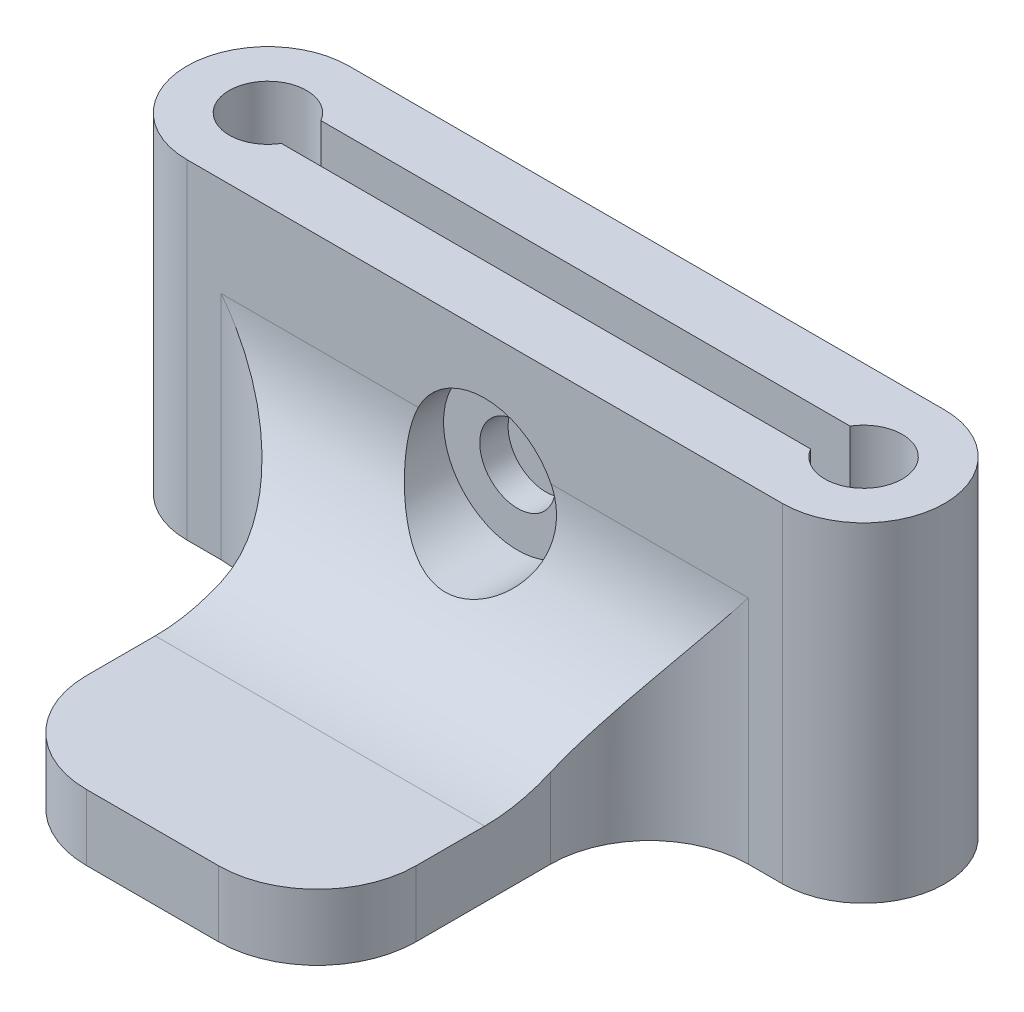
ISO-10303-21;
HEADER;
FILE_DESCRIPTION(('STEP AP214'),'2;1');
FILE_NAME('part.step','',(''),(''),'','','');
FILE_SCHEMA(('AUTOMOTIVE_DESIGN { 1 0 10303 214 1 1 1 1 }'));
ENDSEC;
DATA;
#1=APPLICATION_CONTEXT('core data for automotive mechanical design processes');
#2=APPLICATION_PROTOCOL_DEFINITION('international standard','automotive_design',2000,#1);
#3=PRODUCT_CONTEXT('',#1,'mechanical');
#4=PRODUCT('Part','Part','',(#3));
#5=PRODUCT_RELATED_PRODUCT_CATEGORY('part','',(#4));
#6=PRODUCT_DEFINITION_FORMATION('','',#4);
#7=PRODUCT_DEFINITION_CONTEXT('part definition',#1,'design');
#8=PRODUCT_DEFINITION('design','',#6,#7);
#9=PRODUCT_DEFINITION_SHAPE('','',#8);
#10=(LENGTH_UNIT() NAMED_UNIT(*) SI_UNIT(.MILLI.,.METRE.));
#11=(NAMED_UNIT(*) PLANE_ANGLE_UNIT() SI_UNIT($,.RADIAN.));
#12=(NAMED_UNIT(*) SI_UNIT($,.STERADIAN.) SOLID_ANGLE_UNIT());
#13=UNCERTAINTY_MEASURE_WITH_UNIT(LENGTH_MEASURE(1.E-05),#10,'distance_accuracy_value','');
#14=(GEOMETRIC_REPRESENTATION_CONTEXT(3) GLOBAL_UNCERTAINTY_ASSIGNED_CONTEXT((#13)) GLOBAL_UNIT_ASSIGNED_CONTEXT((#10,
#11,#12)) REPRESENTATION_CONTEXT('',''));
#15=CARTESIAN_POINT('',(0.,0.,0.));
#16=DIRECTION('',(0.,0.,1.));
#17=DIRECTION('',(1.,0.,0.));
#18=AXIS2_PLACEMENT_3D('',#15,#16,#17);
#19=CARTESIAN_POINT('',(0.,6.,-2.46));
#20=DIRECTION('',(0.,0.,1.));
#21=DIRECTION('',(1.,0.,0.));
#22=AXIS2_PLACEMENT_3D('',#19,#20,#21);
#23=CYLINDRICAL_SURFACE('',#22,1.15);
#24=CARTESIAN_POINT('',(0.,6.,-0.6));
#25=DIRECTION('',(0.,0.,-1.));
#26=DIRECTION('',(-1.,0.,0.));
#27=AXIS2_PLACEMENT_3D('',#24,#25,#26);
#28=CIRCLE('',#27,1.15);
#29=CARTESIAN_POINT('',(-1.15,6.,-0.6));
#30=VERTEX_POINT('',#29);
#31=EDGE_CURVE('E256',#30,#30,#28,.T.);
#32=ORIENTED_EDGE('',*,*,#31,.F.);
#33=EDGE_LOOP('',(#32));
#34=FACE_BOUND('',#33,.T.);
#35=CARTESIAN_POINT('',(0.,6.,-1.46));
#36=DIRECTION('',(0.,0.,-1.));
#37=DIRECTION('',(-1.,0.,0.));
#38=AXIS2_PLACEMENT_3D('',#35,#36,#37);
#39=CIRCLE('',#38,1.15);
#40=CARTESIAN_POINT('',(-1.15,6.,-1.46));
#41=VERTEX_POINT('',#40);
#42=EDGE_CURVE('E40',#41,#41,#39,.F.);
#43=ORIENTED_EDGE('',*,*,#42,.F.);
#44=EDGE_LOOP('',(#43));
#45=FACE_BOUND('',#44,.T.);
#46=ADVANCED_FACE('F35',(#34,#45),#23,.F.);
#47=CARTESIAN_POINT('',(0.,7.,7.46));
#48=DIRECTION('',(1.,0.,0.));
#49=DIRECTION('',(0.,0.,-1.));
#50=AXIS2_PLACEMENT_3D('',#47,#48,#49);
#51=CYLINDRICAL_SURFACE('',#50,5.);
#52=CARTESIAN_POINT('',(-2.01556443707464,7.,2.46));
#53=CARTESIAN_POINT('',(-2.04175036487948,6.94723877501467,2.45999300896593));
#54=CARTESIAN_POINT('',(-2.06585073480588,6.89344078288716,2.46083496798393));
#55=CARTESIAN_POINT('',(-2.109745996837,6.78417417126407,2.46436298875684));
#56=CARTESIAN_POINT('',(-2.1295408156261,6.72870552333859,2.46704908191073));
#57=CARTESIAN_POINT('',(-2.16464542210361,6.61664371589301,2.47440230646445));
#58=CARTESIAN_POINT('',(-2.17996638703904,6.56005374260594,2.47906442828374));
#59=CARTESIAN_POINT('',(-2.20611600501055,6.4460681434285,2.49044783021604));
#60=CARTESIAN_POINT('',(-2.21694490592385,6.38867256217325,2.49716899667303));
#61=CARTESIAN_POINT('',(-2.24264423931978,6.21582810991499,2.52051329062134));
#62=CARTESIAN_POINT('',(-2.25073044685787,6.09971140376437,2.54031784448049));
#63=CARTESIAN_POINT('',(-2.24916345106013,5.86938691802106,2.58808175614079));
#64=CARTESIAN_POINT('',(-2.23950854097209,5.75517932315762,2.61604189831789));
#65=CARTESIAN_POINT('',(-2.20330128362021,5.52966744780162,2.67961675487502));
#66=CARTESIAN_POINT('',(-2.17647802356564,5.41844005746845,2.71534801669427));
#67=CARTESIAN_POINT('',(-2.10720173346062,5.20312323497078,2.7926295949892));
#68=CARTESIAN_POINT('',(-2.0647414242777,5.09903715393737,2.83418261593549));
#69=CARTESIAN_POINT('',(-1.96042439546428,4.88895331481458,2.92590946768372));
#70=CARTESIAN_POINT('',(-1.89697947371727,4.78394054653244,2.97653001272573));
#71=CARTESIAN_POINT('',(-1.75450332402742,4.58610252889114,3.07986468572548));
#72=CARTESIAN_POINT('',(-1.67545398528858,4.49329165181003,3.1325811889762));
#73=CARTESIAN_POINT('',(-1.49316365537025,4.31138982243017,3.2429004495677));
#74=CARTESIAN_POINT('',(-1.38818807487377,4.22394569484173,3.30037037042072));
#75=CARTESIAN_POINT('',(-1.16178647687953,4.06827465645595,3.40858514713366));
#76=CARTESIAN_POINT('',(-1.04038385361374,4.00002083408997,3.45933936732241));
#77=CARTESIAN_POINT('',(-0.818732140894735,3.90178255115438,3.53523449939828));
#78=CARTESIAN_POINT('',(-0.721958836539561,3.86643433798268,3.56357487065409));
#79=CARTESIAN_POINT('',(-0.522318848532056,3.80901098755309,3.61045791169847));
#80=CARTESIAN_POINT('',(-0.419461274598913,3.78691653228039,3.62901483654402));
#81=CARTESIAN_POINT('',(-0.209464273058739,3.75724988232855,3.65408703508113));
#82=CARTESIAN_POINT('',(-0.102301160703161,3.74977401624838,3.66052242427202));
#83=CARTESIAN_POINT('',(0.111969247602375,3.75023636948332,3.6601266156609));
#84=CARTESIAN_POINT('',(0.219076546107482,3.75817380707721,3.65329609067029));
#85=CARTESIAN_POINT('',(0.419590330432457,3.78736773012919,3.62864295591844));
#86=CARTESIAN_POINT('',(0.513336099698098,3.80729707031603,3.61191811710916));
#87=CARTESIAN_POINT('',(0.695858269669967,3.85820768835038,3.57024174275521));
#88=CARTESIAN_POINT('',(0.78463079545407,3.88919744912833,3.54528389391442));
#89=CARTESIAN_POINT('',(0.988138973411805,3.97455999036677,3.47871671282776));
#90=CARTESIAN_POINT('',(1.10013056457163,4.03334345609058,3.43437259876656));
#91=CARTESIAN_POINT('',(1.31091732161737,4.16707127503923,3.3391673889957));
#92=CARTESIAN_POINT('',(1.40969339748486,4.24203860643536,3.2882970693531));
#93=CARTESIAN_POINT('',(1.59427449664379,4.40741229380983,3.18352999409671));
#94=CARTESIAN_POINT('',(1.6798884743269,4.49801163912922,3.12960187211222));
#95=CARTESIAN_POINT('',(1.83532446629782,4.69249054414813,3.02291669066662));
#96=CARTESIAN_POINT('',(1.90514521906432,4.79637116368432,2.97015972505774));
#97=CARTESIAN_POINT('',(2.03341840310747,5.026963492781,2.86382861484484));
#98=CARTESIAN_POINT('',(2.09003243538265,5.1549197757315,2.81070161330166));
#99=CARTESIAN_POINT('',(2.17907744769574,5.42216037360604,2.71336204092652));
#100=CARTESIAN_POINT('',(2.21153056570779,5.56143418845957,2.6691413366759));
#101=CARTESIAN_POINT('',(2.24752413279597,5.83273526087939,2.59633360891));
#102=CARTESIAN_POINT('',(2.25359688946893,5.96412568215009,2.56663593014865));
#103=CARTESIAN_POINT('',(2.24230342081865,6.22791725385726,2.51815734328309));
#104=CARTESIAN_POINT('',(2.22495825661386,6.36031738975738,2.49936664760894));
#105=CARTESIAN_POINT('',(2.17625214454224,6.57840887217922,2.477018696461));
#106=CARTESIAN_POINT('',(2.15128327737051,6.66528823235687,2.47049475971174));
#107=CARTESIAN_POINT('',(2.09104857705997,6.83558498201691,2.46196938924199));
#108=CARTESIAN_POINT('',(2.05578791278093,6.91900408538639,2.45996568971696));
#109=CARTESIAN_POINT('',(2.01556443707464,7.,2.46));
#110=B_SPLINE_CURVE_WITH_KNOTS('',3,(#52,#53,#54,#55,#56,#57,#58,#59,#60,#61,#62,#63,#64,#65,
#66,#67,#68,#69,#70,#71,#72,#73,#74,#75,#76,#77,#78,#79,#80,#81,#82,#83,#84,#85,#86,#87,#88,#89,
#90,#91,#92,#93,#94,#95,#96,#97,#98,#99,#100,#101,#102,#103,#104,#105,#106,#107,#108,#109),
.UNSPECIFIED.,.F.,.F.,(4,2,2,2,2,2,2,2,2,2,2,2,2,2,2,2,2,2,2,2,2,2,2,2,2,2,2,2,4),(0.,
0.176656014845354,0.353315037582458,0.529528852443758,0.705732942331843,1.05810966727465,
1.41052029375898,1.7686337707166,2.12691416262203,2.52349284280533,2.92053453534118,
3.36310295556381,3.80504760765345,4.1243800628563,4.44324593691299,4.7642059770903,
5.08514973946491,5.37581603946379,5.66670575044184,6.06665472641688,6.46717533704566,
6.8730500290664,7.27895712985139,7.7255087481676,8.17165069836637,8.57386197025033,
8.97571175065633,9.24688301158131,9.51791831554301),.UNSPECIFIED.);
#111=CARTESIAN_POINT('',(-2.01556443707464,7.,2.46));
#112=VERTEX_POINT('',#111);
#113=CARTESIAN_POINT('',(2.01556443707464,7.,2.46));
#114=VERTEX_POINT('',#113);
#115=EDGE_CURVE('E11',#112,#114,#110,.T.);
#116=ORIENTED_EDGE('',*,*,#115,.F.);
#117=DIRECTION('',(-1.,0.,0.));
#118=VECTOR('',#117,1.);
#119=CARTESIAN_POINT('',(8.,7.,2.46));
#120=LINE('',#119,#118);
#121=CARTESIAN_POINT('',(-8.,7.,2.46));
#122=VERTEX_POINT('',#121);
#123=EDGE_CURVE('E381',#122,#112,#120,.F.);
#124=ORIENTED_EDGE('',*,*,#123,.F.);
#125=CARTESIAN_POINT('',(-5.,2.41742430504416,5.46));
#126=CARTESIAN_POINT('',(-4.99999007584464,2.45619433572678,5.37111111999838));
#127=CARTESIAN_POINT('',(-5.00394885534584,2.49756553159916,5.28342396283325));
#128=CARTESIAN_POINT('',(-5.01909527387803,2.58497092461001,5.11122034191126));
#129=CARTESIAN_POINT('',(-5.0302710810227,2.63099738574335,5.02669892763461));
#130=CARTESIAN_POINT('',(-5.05900041117813,2.72681315065254,4.86214197951033));
#131=CARTESIAN_POINT('',(-5.07648778239047,2.77655933013036,4.78206950990215));
#132=CARTESIAN_POINT('',(-5.11717439439445,2.87977402986982,4.62583225064516));
#133=CARTESIAN_POINT('',(-5.14037657272063,2.93324445430396,4.54966949508105));
#134=CARTESIAN_POINT('',(-5.19855781113315,3.05784842466416,4.38217655542122));
#135=CARTESIAN_POINT('',(-5.23503000053933,3.12994713640746,4.29208183123255));
#136=CARTESIAN_POINT('',(-5.3148218834273,3.27855552023904,4.11875784631887));
#137=CARTESIAN_POINT('',(-5.35814656010761,3.35506837641435,4.03553364946838));
#138=CARTESIAN_POINT('',(-5.45077079658604,3.51210422984339,3.87570229294977));
#139=CARTESIAN_POINT('',(-5.50009596147952,3.59264348248161,3.79912606240481));
#140=CARTESIAN_POINT('',(-5.60362354169447,3.75677463200056,3.65295852675565));
#141=CARTESIAN_POINT('',(-5.65782452771141,3.84036563004705,3.58336518725023));
#142=CARTESIAN_POINT('',(-5.79274014298285,4.04392463557509,3.42462300080977));
#143=CARTESIAN_POINT('',(-5.87542029554436,4.16512727065971,3.33871762693228));
#144=CARTESIAN_POINT('',(-6.04705542389688,4.41143609639691,3.17971495392395));
#145=CARTESIAN_POINT('',(-6.13601288528329,4.53654382227045,3.10662276873676));
#146=CARTESIAN_POINT('',(-6.31881575359726,4.78979065819426,2.97274090730703));
#147=CARTESIAN_POINT('',(-6.41266284424726,4.91793080404366,2.91195550452723));
#148=CARTESIAN_POINT('',(-6.6040431359243,5.17643888357417,2.80228261146679));
#149=CARTESIAN_POINT('',(-6.70157575105506,5.30680646136508,2.75339323916331));
#150=CARTESIAN_POINT('',(-6.99243555246832,5.69263762108821,2.62650236970021));
#151=CARTESIAN_POINT('',(-7.18963215160217,5.9505018544787,2.56433245016192));
#152=CARTESIAN_POINT('',(-7.58839523182633,6.46860044004562,2.48142008987375));
#153=CARTESIAN_POINT('',(-7.7899519738823,6.72882888152428,2.46059336538387));
#154=CARTESIAN_POINT('',(-7.99422653603207,6.99254648939585,2.46000417362007));
#155=CARTESIAN_POINT('',(-7.99711328912772,6.99627327159147,2.46000000728194));
#156=CARTESIAN_POINT('',(-8.,7.,2.46));
#157=B_SPLINE_CURVE_WITH_KNOTS('',3,(#125,#126,#127,#128,#129,#130,#131,#132,#133,#134,#135,
#136,#137,#138,#139,#140,#141,#142,#143,#144,#145,#146,#147,#148,#149,#150,#151,#152,#153,#154,
#155,#156),.UNSPECIFIED.,.F.,.F.,(4,2,2,2,2,2,2,2,2,2,2,2,2,2,2,4),(0.,0.29071592607896,
0.580956446582333,0.868239309782246,1.15567015190112,1.5181890748171,1.88097284765794,
2.24536288350868,2.60964644752272,3.11894232553606,3.62844101097637,4.13811631474608,
4.64771093234505,5.63631090330857,6.6228934001838,6.63703554133181),.UNSPECIFIED.);
#158=CARTESIAN_POINT('',(-5.,2.41742430504416,5.46));
#159=VERTEX_POINT('',#158);
#160=EDGE_CURVE('E387',#159,#122,#157,.T.);
#161=ORIENTED_EDGE('',*,*,#160,.F.);
#162=CARTESIAN_POINT('',(-5.,7.,7.46));
#163=DIRECTION('',(-1.,0.,0.));
#164=DIRECTION('',(0.,0.,1.));
#165=AXIS2_PLACEMENT_3D('',#162,#163,#164);
#166=CIRCLE('',#165,5.);
#167=CARTESIAN_POINT('',(-5.,2.,7.46));
#168=VERTEX_POINT('',#167);
#169=EDGE_CURVE('E384',#168,#159,#166,.F.);
#170=ORIENTED_EDGE('',*,*,#169,.F.);
#171=DIRECTION('',(-1.,0.,0.));
#172=VECTOR('',#171,1.);
#173=CARTESIAN_POINT('',(-8.,2.,7.46));
#174=LINE('',#173,#172);
#175=CARTESIAN_POINT('',(5.,2.,7.46));
#176=VERTEX_POINT('',#175);
#177=EDGE_CURVE('E377',#176,#168,#174,.T.);
#178=ORIENTED_EDGE('',*,*,#177,.F.);
#179=CARTESIAN_POINT('',(5.,7.,7.46));
#180=DIRECTION('',(1.,0.,0.));
#181=DIRECTION('',(0.,0.,-1.));
#182=AXIS2_PLACEMENT_3D('',#179,#180,#181);
#183=CIRCLE('',#182,5.);
#184=CARTESIAN_POINT('',(5.,2.41742430504416,5.46));
#185=VERTEX_POINT('',#184);
#186=EDGE_CURVE('E45',#185,#176,#183,.F.);
#187=ORIENTED_EDGE('',*,*,#186,.F.);
#188=CARTESIAN_POINT('',(5.,2.41742430504416,5.46));
#189=CARTESIAN_POINT('',(4.99999007584464,2.45619433572678,5.37111111999838));
#190=CARTESIAN_POINT('',(5.00394885534584,2.49756553159916,5.28342396283325));
#191=CARTESIAN_POINT('',(5.01909527387803,2.58497092461001,5.11122034191126));
#192=CARTESIAN_POINT('',(5.0302710810227,2.63099738574335,5.02669892763461));
#193=CARTESIAN_POINT('',(5.05900041117812,2.72681315065254,4.86214197951033));
#194=CARTESIAN_POINT('',(5.07648778239047,2.77655933013036,4.78206950990215));
#195=CARTESIAN_POINT('',(5.11717439439445,2.87977402986982,4.62583225064516));
#196=CARTESIAN_POINT('',(5.14037657272063,2.93324445430396,4.54966949508105));
#197=CARTESIAN_POINT('',(5.19855781113315,3.05784842466416,4.38217655542122));
#198=CARTESIAN_POINT('',(5.23503000053933,3.12994713640746,4.29208183123255));
#199=CARTESIAN_POINT('',(5.31482188342729,3.27855552023904,4.11875784631887));
#200=CARTESIAN_POINT('',(5.3581465601076,3.35506837641435,4.03553364946838));
#201=CARTESIAN_POINT('',(5.45077079658604,3.51210422984339,3.87570229294977));
#202=CARTESIAN_POINT('',(5.50009596147952,3.59264348248161,3.79912606240481));
#203=CARTESIAN_POINT('',(5.60362354169447,3.75677463200056,3.65295852675565));
#204=CARTESIAN_POINT('',(5.65782452771141,3.84036563004705,3.58336518725023));
#205=CARTESIAN_POINT('',(5.79274014298285,4.04392463557509,3.42462300080977));
#206=CARTESIAN_POINT('',(5.87542029554436,4.16512727065971,3.33871762693228));
#207=CARTESIAN_POINT('',(6.04705542389688,4.41143609639691,3.17971495392395));
#208=CARTESIAN_POINT('',(6.13601288528328,4.53654382227045,3.10662276873676));
#209=CARTESIAN_POINT('',(6.31881575359726,4.78979065819426,2.97274090730703));
#210=CARTESIAN_POINT('',(6.41266284424725,4.91793080404366,2.91195550452723));
#211=CARTESIAN_POINT('',(6.6040431359243,5.17643888357417,2.80228261146679));
#212=CARTESIAN_POINT('',(6.70157575105506,5.30680646136508,2.75339323916331));
#213=CARTESIAN_POINT('',(6.99243555246831,5.69263762108821,2.62650236970021));
#214=CARTESIAN_POINT('',(7.18963215160217,5.9505018544787,2.56433245016192));
#215=CARTESIAN_POINT('',(7.58839523182633,6.46860044004562,2.48142008987375));
#216=CARTESIAN_POINT('',(7.7899519738823,6.72882888152428,2.46059336538387));
#217=CARTESIAN_POINT('',(7.99422653603207,6.99254648939585,2.46000417362007));
#218=CARTESIAN_POINT('',(7.99711328912772,6.99627327159147,2.46000000728194));
#219=CARTESIAN_POINT('',(8.,7.,2.46));
#220=B_SPLINE_CURVE_WITH_KNOTS('',3,(#188,#189,#190,#191,#192,#193,#194,#195,#196,#197,#198,
#199,#200,#201,#202,#203,#204,#205,#206,#207,#208,#209,#210,#211,#212,#213,#214,#215,#216,#217,
#218,#219),.UNSPECIFIED.,.F.,.F.,(4,2,2,2,2,2,2,2,2,2,2,2,2,2,2,4),(0.,0.29071592607896,
0.580956446582333,0.868239309782246,1.15567015190112,1.5181890748171,1.88097284765794,
2.24536288350868,2.60964644752272,3.11894232553606,3.62844101097637,4.13811631474608,
4.64771093234505,5.63631090330857,6.6228934001838,6.63703554133181),.UNSPECIFIED.);
#221=CARTESIAN_POINT('',(8.,7.,2.46));
#222=VERTEX_POINT('',#221);
#223=EDGE_CURVE('E394',#222,#185,#220,.F.);
#224=ORIENTED_EDGE('',*,*,#223,.F.);
#225=EDGE_CURVE('E380',#114,#222,#120,.F.);
#226=ORIENTED_EDGE('',*,*,#225,.F.);
#227=EDGE_LOOP('',(#116,#124,#161,#170,#178,#187,#224,#226));
#228=FACE_BOUND('',#227,.T.);
#229=ADVANCED_FACE('F37',(#228),#51,.F.);
#230=CARTESIAN_POINT('',(-9.04,10.,0.));
#231=DIRECTION('',(0.,1.,0.));
#232=DIRECTION('',(0.,0.,1.));
#233=AXIS2_PLACEMENT_3D('',#230,#231,#232);
#234=PLANE('',#233);
#235=DIRECTION('',(1.,0.,0.));
#236=VECTOR('',#235,1.);
#237=CARTESIAN_POINT('',(-8.02974013244116,10.,-0.6));
#238=LINE('',#237,#236);
#239=CARTESIAN_POINT('',(-8.02974013244116,10.,-0.599999999999993));
#240=VERTEX_POINT('',#239);
#241=CARTESIAN_POINT('',(8.02974013244116,10.,-0.6));
#242=VERTEX_POINT('',#241);
#243=EDGE_CURVE('E268',#240,#242,#238,.T.);
#244=ORIENTED_EDGE('',*,*,#243,.T.);
#245=CARTESIAN_POINT('',(9.04,10.,0.));
#246=DIRECTION('',(0.,1.,0.));
#247=DIRECTION('',(0.,0.,1.));
#248=AXIS2_PLACEMENT_3D('',#245,#246,#247);
#249=CIRCLE('',#248,1.175);
#250=CARTESIAN_POINT('',(8.02974013244116,10.,0.6));
#251=VERTEX_POINT('',#250);
#252=EDGE_CURVE('E308',#251,#242,#249,.T.);
#253=ORIENTED_EDGE('',*,*,#252,.F.);
#254=DIRECTION('',(-1.,0.,0.));
#255=VECTOR('',#254,1.);
#256=CARTESIAN_POINT('',(-8.02974013244116,10.,0.6));
#257=LINE('',#256,#255);
#258=CARTESIAN_POINT('',(-8.02974013244116,10.,0.6));
#259=VERTEX_POINT('',#258);
#260=EDGE_CURVE('E265',#251,#259,#257,.T.);
#261=ORIENTED_EDGE('',*,*,#260,.T.);
#262=CARTESIAN_POINT('',(-9.04,10.,0.));
#263=DIRECTION('',(0.,1.,0.));
#264=DIRECTION('',(0.,0.,-1.));
#265=AXIS2_PLACEMENT_3D('',#262,#263,#264);
#266=CIRCLE('',#265,1.175);
#267=EDGE_CURVE('E302',#240,#259,#266,.T.);
#268=ORIENTED_EDGE('',*,*,#267,.F.);
#269=EDGE_LOOP('',(#244,#253,#261,#268));
#270=FACE_BOUND('',#269,.T.);
#271=CARTESIAN_POINT('',(-9.04,10.,0.));
#272=DIRECTION('',(0.,1.,0.));
#273=DIRECTION('',(0.,0.,1.));
#274=AXIS2_PLACEMENT_3D('',#271,#272,#273);
#275=CIRCLE('',#274,2.46);
#276=CARTESIAN_POINT('',(-9.04,10.,-2.46));
#277=VERTEX_POINT('',#276);
#278=CARTESIAN_POINT('',(-9.04,10.,2.46));
#279=VERTEX_POINT('',#278);
#280=EDGE_CURVE('E314',#277,#279,#275,.T.);
#281=ORIENTED_EDGE('',*,*,#280,.T.);
#282=DIRECTION('',(1.,0.,0.));
#283=VECTOR('',#282,1.);
#284=CARTESIAN_POINT('',(-9.04,10.,2.46));
#285=LINE('',#284,#283);
#286=CARTESIAN_POINT('',(9.04,10.,2.46));
#287=VERTEX_POINT('',#286);
#288=EDGE_CURVE('E317',#279,#287,#285,.T.);
#289=ORIENTED_EDGE('',*,*,#288,.T.);
#290=CARTESIAN_POINT('',(9.04,10.,0.));
#291=DIRECTION('',(0.,1.,0.));
#292=DIRECTION('',(0.,0.,1.));
#293=AXIS2_PLACEMENT_3D('',#290,#291,#292);
#294=CIRCLE('',#293,2.46);
#295=CARTESIAN_POINT('',(9.04,10.,-2.46));
#296=VERTEX_POINT('',#295);
#297=EDGE_CURVE('E320',#287,#296,#294,.T.);
#298=ORIENTED_EDGE('',*,*,#297,.T.);
#299=DIRECTION('',(-1.,0.,0.));
#300=VECTOR('',#299,1.);
#301=CARTESIAN_POINT('',(-9.04,10.,-2.46));
#302=LINE('',#301,#300);
#303=EDGE_CURVE('E322',#296,#277,#302,.T.);
#304=ORIENTED_EDGE('',*,*,#303,.T.);
#305=EDGE_LOOP('',(#281,#289,#298,#304));
#306=FACE_BOUND('',#305,.T.);
#307=ADVANCED_FACE('F440',(#270,#306),#234,.T.);
#308=CARTESIAN_POINT('',(-9.04,0.,0.));
#309=DIRECTION('',(0.,1.,0.));
#310=DIRECTION('',(0.,0.,1.));
#311=AXIS2_PLACEMENT_3D('',#308,#309,#310);
#312=PLANE('',#311);
#313=DIRECTION('',(-1.,0.,0.));
#314=VECTOR('',#313,1.);
#315=CARTESIAN_POINT('',(-5.,0.,12.54));
#316=LINE('',#315,#314);
#317=CARTESIAN_POINT('',(2.,0.,12.54));
#318=VERTEX_POINT('',#317);
#319=CARTESIAN_POINT('',(-2.,0.,12.54));
#320=VERTEX_POINT('',#319);
#321=EDGE_CURVE('E297',#318,#320,#316,.T.);
#322=ORIENTED_EDGE('',*,*,#321,.T.);
#323=CARTESIAN_POINT('',(-2.,0.,9.54));
#324=DIRECTION('',(0.,1.,0.));
#325=DIRECTION('',(0.,0.,1.));
#326=AXIS2_PLACEMENT_3D('',#323,#324,#325);
#327=CIRCLE('',#326,3.);
#328=CARTESIAN_POINT('',(-5.,0.,9.54));
#329=VERTEX_POINT('',#328);
#330=EDGE_CURVE('E352',#320,#329,#327,.F.);
#331=ORIENTED_EDGE('',*,*,#330,.T.);
#332=DIRECTION('',(0.,0.,-1.));
#333=VECTOR('',#332,1.);
#334=CARTESIAN_POINT('',(-5.,0.,12.54));
#335=LINE('',#334,#333);
#336=CARTESIAN_POINT('',(-5.,0.,5.46));
#337=VERTEX_POINT('',#336);
#338=EDGE_CURVE('E288',#329,#337,#335,.T.);
#339=ORIENTED_EDGE('',*,*,#338,.T.);
#340=CARTESIAN_POINT('',(-8.,0.,5.46));
#341=DIRECTION('',(0.,1.,0.));
#342=DIRECTION('',(0.,0.,1.));
#343=AXIS2_PLACEMENT_3D('',#340,#341,#342);
#344=CIRCLE('',#343,3.);
#345=CARTESIAN_POINT('',(-8.,0.,2.46));
#346=VERTEX_POINT('',#345);
#347=EDGE_CURVE('E375',#337,#346,#344,.T.);
#348=ORIENTED_EDGE('',*,*,#347,.T.);
#349=DIRECTION('',(1.,0.,0.));
#350=VECTOR('',#349,1.);
#351=CARTESIAN_POINT('',(-9.04,0.,2.46));
#352=LINE('',#351,#350);
#353=CARTESIAN_POINT('',(-9.04,0.,2.46));
#354=VERTEX_POINT('',#353);
#355=EDGE_CURVE('E328',#354,#346,#352,.T.);
#356=ORIENTED_EDGE('',*,*,#355,.F.);
#357=CARTESIAN_POINT('',(-9.04,0.,0.));
#358=DIRECTION('',(0.,1.,0.));
#359=DIRECTION('',(0.,0.,1.));
#360=AXIS2_PLACEMENT_3D('',#357,#358,#359);
#361=CIRCLE('',#360,2.46);
#362=CARTESIAN_POINT('',(-9.04,0.,-2.46));
#363=VERTEX_POINT('',#362);
#364=EDGE_CURVE('E311',#363,#354,#361,.T.);
#365=ORIENTED_EDGE('',*,*,#364,.F.);
#366=DIRECTION('',(-1.,0.,0.));
#367=VECTOR('',#366,1.);
#368=CARTESIAN_POINT('',(-9.04,0.,-2.46));
#369=LINE('',#368,#367);
#370=CARTESIAN_POINT('',(9.04,0.,-2.46));
#371=VERTEX_POINT('',#370);
#372=EDGE_CURVE('E318',#371,#363,#369,.T.);
#373=ORIENTED_EDGE('',*,*,#372,.F.);
#374=CARTESIAN_POINT('',(9.04,0.,0.));
#375=DIRECTION('',(0.,1.,0.));
#376=DIRECTION('',(0.,0.,1.));
#377=AXIS2_PLACEMENT_3D('',#374,#375,#376);
#378=CIRCLE('',#377,2.46);
#379=CARTESIAN_POINT('',(9.04,0.,2.46));
#380=VERTEX_POINT('',#379);
#381=EDGE_CURVE('E331',#380,#371,#378,.T.);
#382=ORIENTED_EDGE('',*,*,#381,.F.);
#383=CARTESIAN_POINT('',(8.,0.,2.46));
#384=VERTEX_POINT('',#383);
#385=EDGE_CURVE('E327',#384,#380,#352,.T.);
#386=ORIENTED_EDGE('',*,*,#385,.F.);
#387=CARTESIAN_POINT('',(8.,0.,5.46));
#388=DIRECTION('',(0.,1.,0.));
#389=DIRECTION('',(0.,0.,1.));
#390=AXIS2_PLACEMENT_3D('',#387,#388,#389);
#391=CIRCLE('',#390,3.);
#392=CARTESIAN_POINT('',(5.,0.,5.46));
#393=VERTEX_POINT('',#392);
#394=EDGE_CURVE('E373',#384,#393,#391,.T.);
#395=ORIENTED_EDGE('',*,*,#394,.T.);
#396=DIRECTION('',(0.,0.,1.));
#397=VECTOR('',#396,1.);
#398=CARTESIAN_POINT('',(5.,0.,12.54));
#399=LINE('',#398,#397);
#400=CARTESIAN_POINT('',(5.,0.,9.54));
#401=VERTEX_POINT('',#400);
#402=EDGE_CURVE('E278',#393,#401,#399,.T.);
#403=ORIENTED_EDGE('',*,*,#402,.T.);
#404=CARTESIAN_POINT('',(2.,0.,9.54));
#405=DIRECTION('',(0.,1.,0.));
#406=DIRECTION('',(0.,0.,1.));
#407=AXIS2_PLACEMENT_3D('',#404,#405,#406);
#408=CIRCLE('',#407,3.);
#409=EDGE_CURVE('E350',#401,#318,#408,.F.);
#410=ORIENTED_EDGE('',*,*,#409,.T.);
#411=EDGE_LOOP('',(#322,#331,#339,#348,#356,#365,#373,#382,#386,#395,#403,#410));
#412=FACE_BOUND('',#411,.T.);
#413=CARTESIAN_POINT('',(9.04,0.,0.));
#414=DIRECTION('',(0.,1.,0.));
#415=DIRECTION('',(0.,0.,1.));
#416=AXIS2_PLACEMENT_3D('',#413,#414,#415);
#417=CIRCLE('',#416,1.175);
#418=CARTESIAN_POINT('',(8.02974013244116,0.,0.6));
#419=VERTEX_POINT('',#418);
#420=CARTESIAN_POINT('',(8.02974013244116,0.,-0.6));
#421=VERTEX_POINT('',#420);
#422=EDGE_CURVE('E305',#419,#421,#417,.T.);
#423=ORIENTED_EDGE('',*,*,#422,.T.);
#424=DIRECTION('',(1.,0.,0.));
#425=VECTOR('',#424,1.);
#426=CARTESIAN_POINT('',(-8.02974013244116,0.,-0.6));
#427=LINE('',#426,#425);
#428=CARTESIAN_POINT('',(-8.02974013244116,0.,-0.6));
#429=VERTEX_POINT('',#428);
#430=EDGE_CURVE('E269',#429,#421,#427,.T.);
#431=ORIENTED_EDGE('',*,*,#430,.F.);
#432=CARTESIAN_POINT('',(-9.04,0.,0.));
#433=DIRECTION('',(0.,1.,0.));
#434=DIRECTION('',(0.,0.,-1.));
#435=AXIS2_PLACEMENT_3D('',#432,#433,#434);
#436=CIRCLE('',#435,1.175);
#437=CARTESIAN_POINT('',(-8.02974013244116,0.,0.599999999999993));
#438=VERTEX_POINT('',#437);
#439=EDGE_CURVE('E294',#429,#438,#436,.T.);
#440=ORIENTED_EDGE('',*,*,#439,.T.);
#441=DIRECTION('',(-1.,0.,0.));
#442=VECTOR('',#441,1.);
#443=CARTESIAN_POINT('',(-8.02974013244116,0.,0.6));
#444=LINE('',#443,#442);
#445=EDGE_CURVE('E264',#419,#438,#444,.T.);
#446=ORIENTED_EDGE('',*,*,#445,.F.);
#447=EDGE_LOOP('',(#423,#431,#440,#446));
#448=FACE_BOUND('',#447,.T.);
#449=ADVANCED_FACE('F424',(#412,#448),#312,.F.);
#450=CARTESIAN_POINT('',(-9.04,10.,0.));
#451=DIRECTION('',(0.,-1.,0.));
#452=DIRECTION('',(0.,0.,-1.));
#453=AXIS2_PLACEMENT_3D('',#450,#451,#452);
#454=CYLINDRICAL_SURFACE('',#453,2.46);
#455=ORIENTED_EDGE('',*,*,#364,.T.);
#456=DIRECTION('',(0.,-1.,0.));
#457=VECTOR('',#456,1.);
#458=CARTESIAN_POINT('',(-9.04,10.,2.46));
#459=LINE('',#458,#457);
#460=EDGE_CURVE('E342',#279,#354,#459,.T.);
#461=ORIENTED_EDGE('',*,*,#460,.F.);
#462=ORIENTED_EDGE('',*,*,#280,.F.);
#463=DIRECTION('',(0.,-1.,0.));
#464=VECTOR('',#463,1.);
#465=CARTESIAN_POINT('',(-9.04,10.,-2.46));
#466=LINE('',#465,#464);
#467=EDGE_CURVE('E324',#277,#363,#466,.T.);
#468=ORIENTED_EDGE('',*,*,#467,.T.);
#469=EDGE_LOOP('',(#455,#461,#462,#468));
#470=FACE_BOUND('',#469,.T.);
#471=ADVANCED_FACE('F420',(#470),#454,.T.);
#472=CARTESIAN_POINT('',(-9.04,10.,2.46));
#473=DIRECTION('',(0.,0.,-1.));
#474=DIRECTION('',(-1.,0.,0.));
#475=AXIS2_PLACEMENT_3D('',#472,#473,#474);
#476=PLANE('',#475);
#477=CARTESIAN_POINT('',(0.,6.,2.46));
#478=DIRECTION('',(0.,0.,-1.));
#479=DIRECTION('',(-1.,0.,0.));
#480=AXIS2_PLACEMENT_3D('',#477,#478,#479);
#481=CIRCLE('',#480,2.25);
#482=EDGE_CURVE('E59',#114,#112,#481,.F.);
#483=ORIENTED_EDGE('',*,*,#482,.F.);
#484=ORIENTED_EDGE('',*,*,#225,.T.);
#485=DIRECTION('',(0.,-1.,0.));
#486=VECTOR('',#485,1.);
#487=CARTESIAN_POINT('',(8.,10.,2.46));
#488=LINE('',#487,#486);
#489=EDGE_CURVE('E370',#222,#384,#488,.T.);
#490=ORIENTED_EDGE('',*,*,#489,.T.);
#491=ORIENTED_EDGE('',*,*,#385,.T.);
#492=DIRECTION('',(0.,-1.,0.));
#493=VECTOR('',#492,1.);
#494=CARTESIAN_POINT('',(9.04,10.,2.46));
#495=LINE('',#494,#493);
#496=EDGE_CURVE('E339',#287,#380,#495,.T.);
#497=ORIENTED_EDGE('',*,*,#496,.F.);
#498=ORIENTED_EDGE('',*,*,#288,.F.);
#499=ORIENTED_EDGE('',*,*,#460,.T.);
#500=ORIENTED_EDGE('',*,*,#355,.T.);
#501=DIRECTION('',(0.,1.,0.));
#502=VECTOR('',#501,1.);
#503=CARTESIAN_POINT('',(-8.,10.,2.46));
#504=LINE('',#503,#502);
#505=EDGE_CURVE('E368',#346,#122,#504,.T.);
#506=ORIENTED_EDGE('',*,*,#505,.T.);
#507=ORIENTED_EDGE('',*,*,#123,.T.);
#508=EDGE_LOOP('',(#483,#484,#490,#491,#497,#498,#499,#500,#506,#507));
#509=FACE_BOUND('',#508,.T.);
#510=ADVANCED_FACE('F423',(#509),#476,.F.);
#511=CARTESIAN_POINT('',(9.04,10.,0.));
#512=DIRECTION('',(0.,-1.,0.));
#513=DIRECTION('',(0.,0.,-1.));
#514=AXIS2_PLACEMENT_3D('',#511,#512,#513);
#515=CYLINDRICAL_SURFACE('',#514,2.46);
#516=ORIENTED_EDGE('',*,*,#381,.T.);
#517=DIRECTION('',(0.,-1.,0.));
#518=VECTOR('',#517,1.);
#519=CARTESIAN_POINT('',(9.04,10.,-2.46));
#520=LINE('',#519,#518);
#521=EDGE_CURVE('E336',#296,#371,#520,.T.);
#522=ORIENTED_EDGE('',*,*,#521,.F.);
#523=ORIENTED_EDGE('',*,*,#297,.F.);
#524=ORIENTED_EDGE('',*,*,#496,.T.);
#525=EDGE_LOOP('',(#516,#522,#523,#524));
#526=FACE_BOUND('',#525,.T.);
#527=ADVANCED_FACE('F428',(#526),#515,.T.);
#528=CARTESIAN_POINT('',(-9.04,10.,-2.46));
#529=DIRECTION('',(0.,0.,1.));
#530=DIRECTION('',(1.,0.,0.));
#531=AXIS2_PLACEMENT_3D('',#528,#529,#530);
#532=PLANE('',#531);
#533=DIRECTION('',(0.866025403784438,-0.5,0.));
#534=VECTOR('',#533,1.);
#535=CARTESIAN_POINT('',(0.,8.42487113059643,-2.46));
#536=LINE('',#535,#534);
#537=CARTESIAN_POINT('',(0.,8.42487113059643,-2.46));
#538=VERTEX_POINT('',#537);
#539=CARTESIAN_POINT('',(2.1,7.21243556529821,-2.46));
#540=VERTEX_POINT('',#539);
#541=EDGE_CURVE('E234',#538,#540,#536,.T.);
#542=ORIENTED_EDGE('',*,*,#541,.F.);
#543=DIRECTION('',(0.866025403784439,0.499999999999999,0.));
#544=VECTOR('',#543,1.);
#545=CARTESIAN_POINT('',(-2.1,7.21243556529822,-2.46));
#546=LINE('',#545,#544);
#547=CARTESIAN_POINT('',(-2.1,7.21243556529822,-2.46));
#548=VERTEX_POINT('',#547);
#549=EDGE_CURVE('E53',#548,#538,#546,.T.);
#550=ORIENTED_EDGE('',*,*,#549,.F.);
#551=DIRECTION('',(0.,1.,0.));
#552=VECTOR('',#551,1.);
#553=CARTESIAN_POINT('',(-2.1,4.78756443470179,-2.46));
#554=LINE('',#553,#552);
#555=CARTESIAN_POINT('',(-2.1,4.78756443470179,-2.46));
#556=VERTEX_POINT('',#555);
#557=EDGE_CURVE('E220',#556,#548,#554,.T.);
#558=ORIENTED_EDGE('',*,*,#557,.F.);
#559=DIRECTION('',(-0.866025403784438,0.5,0.));
#560=VECTOR('',#559,1.);
#561=CARTESIAN_POINT('',(0.,3.57512886940357,-2.46));
#562=LINE('',#561,#560);
#563=CARTESIAN_POINT('',(0.,3.57512886940357,-2.46));
#564=VERTEX_POINT('',#563);
#565=EDGE_CURVE('E223',#564,#556,#562,.T.);
#566=ORIENTED_EDGE('',*,*,#565,.F.);
#567=DIRECTION('',(-0.866025403784439,-0.499999999999999,0.));
#568=VECTOR('',#567,1.);
#569=CARTESIAN_POINT('',(2.1,4.78756443470178,-2.46));
#570=LINE('',#569,#568);
#571=CARTESIAN_POINT('',(2.1,4.78756443470178,-2.46));
#572=VERTEX_POINT('',#571);
#573=EDGE_CURVE('E239',#572,#564,#570,.T.);
#574=ORIENTED_EDGE('',*,*,#573,.F.);
#575=DIRECTION('',(0.,-1.,0.));
#576=VECTOR('',#575,1.);
#577=CARTESIAN_POINT('',(2.1,7.21243556529821,-2.46));
#578=LINE('',#577,#576);
#579=EDGE_CURVE('E236',#540,#572,#578,.T.);
#580=ORIENTED_EDGE('',*,*,#579,.F.);
#581=EDGE_LOOP('',(#542,#550,#558,#566,#574,#580));
#582=FACE_BOUND('',#581,.T.);
#583=ORIENTED_EDGE('',*,*,#372,.T.);
#584=ORIENTED_EDGE('',*,*,#467,.F.);
#585=ORIENTED_EDGE('',*,*,#303,.F.);
#586=ORIENTED_EDGE('',*,*,#521,.T.);
#587=EDGE_LOOP('',(#583,#584,#585,#586));
#588=FACE_BOUND('',#587,.T.);
#589=ADVANCED_FACE('F432',(#582,#588),#532,.F.);
#590=CARTESIAN_POINT('',(9.04,10.,0.));
#591=DIRECTION('',(0.,-1.,0.));
#592=DIRECTION('',(0.,0.,-1.));
#593=AXIS2_PLACEMENT_3D('',#590,#591,#592);
#594=CYLINDRICAL_SURFACE('',#593,1.175);
#595=DIRECTION('',(0.,-1.,0.));
#596=VECTOR('',#595,1.);
#597=CARTESIAN_POINT('',(8.02974013244116,10.,-0.6));
#598=LINE('',#597,#596);
#599=EDGE_CURVE('E275',#242,#421,#598,.T.);
#600=ORIENTED_EDGE('',*,*,#599,.T.);
#601=ORIENTED_EDGE('',*,*,#422,.F.);
#602=DIRECTION('',(0.,-1.,0.));
#603=VECTOR('',#602,1.);
#604=CARTESIAN_POINT('',(8.02974013244116,10.,0.6));
#605=LINE('',#604,#603);
#606=EDGE_CURVE('E272',#251,#419,#605,.T.);
#607=ORIENTED_EDGE('',*,*,#606,.F.);
#608=ORIENTED_EDGE('',*,*,#252,.T.);
#609=EDGE_LOOP('',(#600,#601,#607,#608));
#610=FACE_BOUND('',#609,.T.);
#611=ADVANCED_FACE('F436',(#610),#594,.F.);
#612=CARTESIAN_POINT('',(-9.04,10.,0.));
#613=DIRECTION('',(0.,-1.,0.));
#614=DIRECTION('',(0.,0.,-1.));
#615=AXIS2_PLACEMENT_3D('',#612,#613,#614);
#616=CYLINDRICAL_SURFACE('',#615,1.175);
#617=DIRECTION('',(0.,-1.,0.));
#618=VECTOR('',#617,1.);
#619=CARTESIAN_POINT('',(-8.02974013244116,10.,-0.6));
#620=LINE('',#619,#618);
#621=EDGE_CURVE('E279',#240,#429,#620,.T.);
#622=ORIENTED_EDGE('',*,*,#621,.F.);
#623=ORIENTED_EDGE('',*,*,#267,.T.);
#624=DIRECTION('',(0.,-1.,0.));
#625=VECTOR('',#624,1.);
#626=CARTESIAN_POINT('',(-8.02974013244116,10.,0.6));
#627=LINE('',#626,#625);
#628=EDGE_CURVE('E281',#259,#438,#627,.T.);
#629=ORIENTED_EDGE('',*,*,#628,.T.);
#630=ORIENTED_EDGE('',*,*,#439,.F.);
#631=EDGE_LOOP('',(#622,#623,#629,#630));
#632=FACE_BOUND('',#631,.T.);
#633=ADVANCED_FACE('F447',(#632),#616,.F.);
#634=CARTESIAN_POINT('',(5.,2.,12.54));
#635=DIRECTION('',(1.,0.,0.));
#636=DIRECTION('',(0.,0.,-1.));
#637=AXIS2_PLACEMENT_3D('',#634,#635,#636);
#638=PLANE('',#637);
#639=DIRECTION('',(0.,-1.,0.));
#640=VECTOR('',#639,1.);
#641=CARTESIAN_POINT('',(5.,2.,5.46));
#642=LINE('',#641,#640);
#643=EDGE_CURVE('E363',#393,#185,#642,.F.);
#644=ORIENTED_EDGE('',*,*,#643,.T.);
#645=ORIENTED_EDGE('',*,*,#186,.T.);
#646=DIRECTION('',(0.,0.,1.));
#647=VECTOR('',#646,1.);
#648=CARTESIAN_POINT('',(5.,2.,12.54));
#649=LINE('',#648,#647);
#650=CARTESIAN_POINT('',(5.,2.,9.54));
#651=VERTEX_POINT('',#650);
#652=EDGE_CURVE('E285',#176,#651,#649,.T.);
#653=ORIENTED_EDGE('',*,*,#652,.T.);
#654=DIRECTION('',(0.,-1.,0.));
#655=VECTOR('',#654,1.);
#656=CARTESIAN_POINT('',(5.,2.,9.54));
#657=LINE('',#656,#655);
#658=EDGE_CURVE('E365',#651,#401,#657,.T.);
#659=ORIENTED_EDGE('',*,*,#658,.T.);
#660=ORIENTED_EDGE('',*,*,#402,.F.);
#661=EDGE_LOOP('',(#644,#645,#653,#659,#660));
#662=FACE_BOUND('',#661,.T.);
#663=ADVANCED_FACE('F451',(#662),#638,.T.);
#664=CARTESIAN_POINT('',(-5.,2.,12.54));
#665=DIRECTION('',(-1.,0.,0.));
#666=DIRECTION('',(0.,0.,1.));
#667=AXIS2_PLACEMENT_3D('',#664,#665,#666);
#668=PLANE('',#667);
#669=ORIENTED_EDGE('',*,*,#338,.F.);
#670=DIRECTION('',(0.,-1.,0.));
#671=VECTOR('',#670,1.);
#672=CARTESIAN_POINT('',(-5.,2.,9.54));
#673=LINE('',#672,#671);
#674=CARTESIAN_POINT('',(-5.,2.,9.54));
#675=VERTEX_POINT('',#674);
#676=EDGE_CURVE('E356',#329,#675,#673,.F.);
#677=ORIENTED_EDGE('',*,*,#676,.T.);
#678=DIRECTION('',(0.,0.,-1.));
#679=VECTOR('',#678,1.);
#680=CARTESIAN_POINT('',(-5.,2.,12.54));
#681=LINE('',#680,#679);
#682=EDGE_CURVE('E291',#675,#168,#681,.T.);
#683=ORIENTED_EDGE('',*,*,#682,.T.);
#684=ORIENTED_EDGE('',*,*,#169,.T.);
#685=DIRECTION('',(0.,1.,0.));
#686=VECTOR('',#685,1.);
#687=CARTESIAN_POINT('',(-5.,2.,5.46));
#688=LINE('',#687,#686);
#689=EDGE_CURVE('E354',#159,#337,#688,.F.);
#690=ORIENTED_EDGE('',*,*,#689,.T.);
#691=EDGE_LOOP('',(#669,#677,#683,#684,#690));
#692=FACE_BOUND('',#691,.T.);
#693=ADVANCED_FACE('F455',(#692),#668,.T.);
#694=CARTESIAN_POINT('',(0.,2.,0.));
#695=DIRECTION('',(0.,-1.,0.));
#696=DIRECTION('',(0.,0.,-1.));
#697=AXIS2_PLACEMENT_3D('',#694,#695,#696);
#698=PLANE('',#697);
#699=ORIENTED_EDGE('',*,*,#652,.F.);
#700=ORIENTED_EDGE('',*,*,#177,.T.);
#701=ORIENTED_EDGE('',*,*,#682,.F.);
#702=CARTESIAN_POINT('',(-2.,2.,9.54));
#703=DIRECTION('',(0.,-1.,0.));
#704=DIRECTION('',(0.,0.,-1.));
#705=AXIS2_PLACEMENT_3D('',#702,#703,#704);
#706=CIRCLE('',#705,3.);
#707=CARTESIAN_POINT('',(-2.,2.,12.54));
#708=VERTEX_POINT('',#707);
#709=EDGE_CURVE('E361',#675,#708,#706,.F.);
#710=ORIENTED_EDGE('',*,*,#709,.T.);
#711=DIRECTION('',(-1.,0.,0.));
#712=VECTOR('',#711,1.);
#713=CARTESIAN_POINT('',(-5.,2.,12.54));
#714=LINE('',#713,#712);
#715=CARTESIAN_POINT('',(2.,2.,12.54));
#716=VERTEX_POINT('',#715);
#717=EDGE_CURVE('E287',#716,#708,#714,.T.);
#718=ORIENTED_EDGE('',*,*,#717,.F.);
#719=CARTESIAN_POINT('',(2.,2.,9.54));
#720=DIRECTION('',(0.,-1.,0.));
#721=DIRECTION('',(0.,0.,-1.));
#722=AXIS2_PLACEMENT_3D('',#719,#720,#721);
#723=CIRCLE('',#722,3.);
#724=EDGE_CURVE('E358',#716,#651,#723,.F.);
#725=ORIENTED_EDGE('',*,*,#724,.T.);
#726=EDGE_LOOP('',(#699,#700,#701,#710,#718,#725));
#727=FACE_BOUND('',#726,.T.);
#728=ADVANCED_FACE('F459',(#727),#698,.F.);
#729=CARTESIAN_POINT('',(-5.,2.,12.54));
#730=DIRECTION('',(0.,0.,1.));
#731=DIRECTION('',(1.,0.,0.));
#732=AXIS2_PLACEMENT_3D('',#729,#730,#731);
#733=PLANE('',#732);
#734=ORIENTED_EDGE('',*,*,#717,.T.);
#735=DIRECTION('',(0.,-1.,0.));
#736=VECTOR('',#735,1.);
#737=CARTESIAN_POINT('',(-2.,2.,12.54));
#738=LINE('',#737,#736);
#739=EDGE_CURVE('E347',#708,#320,#738,.T.);
#740=ORIENTED_EDGE('',*,*,#739,.T.);
#741=ORIENTED_EDGE('',*,*,#321,.F.);
#742=DIRECTION('',(0.,-1.,0.));
#743=VECTOR('',#742,1.);
#744=CARTESIAN_POINT('',(2.,2.,12.54));
#745=LINE('',#744,#743);
#746=EDGE_CURVE('E345',#318,#716,#745,.F.);
#747=ORIENTED_EDGE('',*,*,#746,.T.);
#748=EDGE_LOOP('',(#734,#740,#741,#747));
#749=FACE_BOUND('',#748,.T.);
#750=ADVANCED_FACE('F418',(#749),#733,.T.);
#751=CARTESIAN_POINT('',(-2.,2.,9.54));
#752=DIRECTION('',(0.,-1.,0.));
#753=DIRECTION('',(0.,0.,-1.));
#754=AXIS2_PLACEMENT_3D('',#751,#752,#753);
#755=CYLINDRICAL_SURFACE('',#754,3.);
#756=ORIENTED_EDGE('',*,*,#709,.F.);
#757=ORIENTED_EDGE('',*,*,#676,.F.);
#758=ORIENTED_EDGE('',*,*,#330,.F.);
#759=ORIENTED_EDGE('',*,*,#739,.F.);
#760=EDGE_LOOP('',(#756,#757,#758,#759));
#761=FACE_BOUND('',#760,.T.);
#762=ADVANCED_FACE('F414',(#761),#755,.T.);
#763=CARTESIAN_POINT('',(2.,2.,9.54));
#764=DIRECTION('',(0.,-1.,0.));
#765=DIRECTION('',(0.,0.,-1.));
#766=AXIS2_PLACEMENT_3D('',#763,#764,#765);
#767=CYLINDRICAL_SURFACE('',#766,3.);
#768=ORIENTED_EDGE('',*,*,#724,.F.);
#769=ORIENTED_EDGE('',*,*,#746,.F.);
#770=ORIENTED_EDGE('',*,*,#409,.F.);
#771=ORIENTED_EDGE('',*,*,#658,.F.);
#772=EDGE_LOOP('',(#768,#769,#770,#771));
#773=FACE_BOUND('',#772,.T.);
#774=ADVANCED_FACE('F410',(#773),#767,.T.);
#775=CARTESIAN_POINT('',(8.,10.,5.46));
#776=DIRECTION('',(0.,-1.,0.));
#777=DIRECTION('',(0.,0.,-1.));
#778=AXIS2_PLACEMENT_3D('',#775,#776,#777);
#779=CYLINDRICAL_SURFACE('',#778,3.);
#780=ORIENTED_EDGE('',*,*,#489,.F.);
#781=ORIENTED_EDGE('',*,*,#223,.T.);
#782=ORIENTED_EDGE('',*,*,#643,.F.);
#783=ORIENTED_EDGE('',*,*,#394,.F.);
#784=EDGE_LOOP('',(#780,#781,#782,#783));
#785=FACE_BOUND('',#784,.T.);
#786=ADVANCED_FACE('F405',(#785),#779,.F.);
#787=CARTESIAN_POINT('',(-8.,10.,5.46));
#788=DIRECTION('',(0.,1.,0.));
#789=DIRECTION('',(0.,0.,1.));
#790=AXIS2_PLACEMENT_3D('',#787,#788,#789);
#791=CYLINDRICAL_SURFACE('',#790,3.);
#792=ORIENTED_EDGE('',*,*,#347,.F.);
#793=ORIENTED_EDGE('',*,*,#689,.F.);
#794=ORIENTED_EDGE('',*,*,#160,.T.);
#795=ORIENTED_EDGE('',*,*,#505,.F.);
#796=EDGE_LOOP('',(#792,#793,#794,#795));
#797=FACE_BOUND('',#796,.T.);
#798=ADVANCED_FACE('F401',(#797),#791,.F.);
#799=CARTESIAN_POINT('',(-8.02974013244116,10.,0.6));
#800=DIRECTION('',(0.,0.,1.));
#801=DIRECTION('',(1.,0.,0.));
#802=AXIS2_PLACEMENT_3D('',#799,#800,#801);
#803=PLANE('',#802);
#804=CARTESIAN_POINT('',(0.,6.,0.6));
#805=DIRECTION('',(0.,0.,1.));
#806=DIRECTION('',(1.,0.,0.));
#807=AXIS2_PLACEMENT_3D('',#804,#805,#806);
#808=CIRCLE('',#807,1.15);
#809=CARTESIAN_POINT('',(1.15,6.,0.6));
#810=VERTEX_POINT('',#809);
#811=EDGE_CURVE('E257',#810,#810,#808,.T.);
#812=ORIENTED_EDGE('',*,*,#811,.T.);
#813=EDGE_LOOP('',(#812));
#814=FACE_BOUND('',#813,.T.);
#815=ORIENTED_EDGE('',*,*,#445,.T.);
#816=ORIENTED_EDGE('',*,*,#628,.F.);
#817=ORIENTED_EDGE('',*,*,#260,.F.);
#818=ORIENTED_EDGE('',*,*,#606,.T.);
#819=EDGE_LOOP('',(#815,#816,#817,#818));
#820=FACE_BOUND('',#819,.T.);
#821=ADVANCED_FACE('F404',(#814,#820),#803,.F.);
#822=CARTESIAN_POINT('',(-8.02974013244116,10.,-0.6));
#823=DIRECTION('',(0.,0.,-1.));
#824=DIRECTION('',(-1.,0.,0.));
#825=AXIS2_PLACEMENT_3D('',#822,#823,#824);
#826=PLANE('',#825);
#827=ORIENTED_EDGE('',*,*,#31,.T.);
#828=EDGE_LOOP('',(#827));
#829=FACE_BOUND('',#828,.T.);
#830=ORIENTED_EDGE('',*,*,#430,.T.);
#831=ORIENTED_EDGE('',*,*,#599,.F.);
#832=ORIENTED_EDGE('',*,*,#243,.F.);
#833=ORIENTED_EDGE('',*,*,#621,.T.);
#834=EDGE_LOOP('',(#830,#831,#832,#833));
#835=FACE_BOUND('',#834,.T.);
#836=ADVANCED_FACE('F469',(#829,#835),#826,.F.);
#837=CARTESIAN_POINT('',(0.,6.,12.54));
#838=DIRECTION('',(0.,0.,-1.));
#839=DIRECTION('',(-1.,0.,0.));
#840=AXIS2_PLACEMENT_3D('',#837,#838,#839);
#841=CYLINDRICAL_SURFACE('',#840,2.25);
#842=CARTESIAN_POINT('',(0.,6.,1.46));
#843=DIRECTION('',(0.,0.,1.));
#844=DIRECTION('',(1.,0.,0.));
#845=AXIS2_PLACEMENT_3D('',#842,#843,#844);
#846=CIRCLE('',#845,2.25);
#847=CARTESIAN_POINT('',(2.25,6.,1.46));
#848=VERTEX_POINT('',#847);
#849=EDGE_CURVE('E260',#848,#848,#846,.T.);
#850=ORIENTED_EDGE('',*,*,#849,.F.);
#851=EDGE_LOOP('',(#850));
#852=FACE_BOUND('',#851,.T.);
#853=ORIENTED_EDGE('',*,*,#482,.T.);
#854=ORIENTED_EDGE('',*,*,#115,.T.);
#855=EDGE_LOOP('',(#853,#854));
#856=FACE_BOUND('',#855,.T.);
#857=ADVANCED_FACE('F473',(#852,#856),#841,.F.);
#858=CARTESIAN_POINT('',(0.,6.,1.46));
#859=DIRECTION('',(0.,0.,1.));
#860=DIRECTION('',(1.,0.,0.));
#861=AXIS2_PLACEMENT_3D('',#858,#859,#860);
#862=PLANE('',#861);
#863=CARTESIAN_POINT('',(0.,6.,1.46));
#864=DIRECTION('',(0.,0.,1.));
#865=DIRECTION('',(1.,0.,0.));
#866=AXIS2_PLACEMENT_3D('',#863,#864,#865);
#867=CIRCLE('',#866,1.15);
#868=CARTESIAN_POINT('',(1.15,6.,1.46));
#869=VERTEX_POINT('',#868);
#870=EDGE_CURVE('E253',#869,#869,#867,.T.);
#871=ORIENTED_EDGE('',*,*,#870,.F.);
#872=EDGE_LOOP('',(#871));
#873=FACE_BOUND('',#872,.T.);
#874=ORIENTED_EDGE('',*,*,#849,.T.);
#875=EDGE_LOOP('',(#874));
#876=FACE_BOUND('',#875,.T.);
#877=ADVANCED_FACE('F478',(#873,#876),#862,.T.);
#878=ORIENTED_EDGE('',*,*,#870,.T.);
#879=EDGE_LOOP('',(#878));
#880=FACE_BOUND('',#879,.T.);
#881=ORIENTED_EDGE('',*,*,#811,.F.);
#882=EDGE_LOOP('',(#881));
#883=FACE_BOUND('',#882,.T.);
#884=ADVANCED_FACE('F491',(#880,#883),#23,.F.);
#885=CARTESIAN_POINT('',(0.,0.,-1.46));
#886=DIRECTION('',(0.,0.,-1.));
#887=DIRECTION('',(-1.,0.,0.));
#888=AXIS2_PLACEMENT_3D('',#885,#886,#887);
#889=PLANE('',#888);
#890=DIRECTION('',(0.866025403784439,0.499999999999999,0.));
#891=VECTOR('',#890,1.);
#892=CARTESIAN_POINT('',(-2.1,7.21243556529822,-1.46));
#893=LINE('',#892,#891);
#894=CARTESIAN_POINT('',(-2.1,7.21243556529822,-1.46));
#895=VERTEX_POINT('',#894);
#896=CARTESIAN_POINT('',(0.,8.42487113059643,-1.46));
#897=VERTEX_POINT('',#896);
#898=EDGE_CURVE('E200',#895,#897,#893,.T.);
#899=ORIENTED_EDGE('',*,*,#898,.T.);
#900=DIRECTION('',(0.866025403784438,-0.5,0.));
#901=VECTOR('',#900,1.);
#902=CARTESIAN_POINT('',(0.,8.42487113059643,-1.46));
#903=LINE('',#902,#901);
#904=CARTESIAN_POINT('',(2.1,7.21243556529821,-1.46));
#905=VERTEX_POINT('',#904);
#906=EDGE_CURVE('E209',#897,#905,#903,.T.);
#907=ORIENTED_EDGE('',*,*,#906,.T.);
#908=DIRECTION('',(0.,-1.,0.));
#909=VECTOR('',#908,1.);
#910=CARTESIAN_POINT('',(2.1,7.21243556529821,-1.46));
#911=LINE('',#910,#909);
#912=CARTESIAN_POINT('',(2.1,4.78756443470178,-1.46));
#913=VERTEX_POINT('',#912);
#914=EDGE_CURVE('E214',#905,#913,#911,.T.);
#915=ORIENTED_EDGE('',*,*,#914,.T.);
#916=DIRECTION('',(-0.866025403784439,-0.499999999999999,0.));
#917=VECTOR('',#916,1.);
#918=CARTESIAN_POINT('',(2.1,4.78756443470178,-1.46));
#919=LINE('',#918,#917);
#920=CARTESIAN_POINT('',(0.,3.57512886940357,-1.46));
#921=VERTEX_POINT('',#920);
#922=EDGE_CURVE('E227',#913,#921,#919,.T.);
#923=ORIENTED_EDGE('',*,*,#922,.T.);
#924=DIRECTION('',(-0.866025403784438,0.5,0.));
#925=VECTOR('',#924,1.);
#926=CARTESIAN_POINT('',(0.,3.57512886940357,-1.46));
#927=LINE('',#926,#925);
#928=CARTESIAN_POINT('',(-2.1,4.78756443470179,-1.46));
#929=VERTEX_POINT('',#928);
#930=EDGE_CURVE('E230',#921,#929,#927,.T.);
#931=ORIENTED_EDGE('',*,*,#930,.T.);
#932=DIRECTION('',(0.,1.,0.));
#933=VECTOR('',#932,1.);
#934=CARTESIAN_POINT('',(-2.1,4.78756443470179,-1.46));
#935=LINE('',#934,#933);
#936=EDGE_CURVE('E206',#929,#895,#935,.T.);
#937=ORIENTED_EDGE('',*,*,#936,.T.);
#938=EDGE_LOOP('',(#899,#907,#915,#923,#931,#937));
#939=FACE_BOUND('',#938,.T.);
#940=ORIENTED_EDGE('',*,*,#42,.T.);
#941=EDGE_LOOP('',(#940));
#942=FACE_BOUND('',#941,.T.);
#943=ADVANCED_FACE('F216',(#939,#942),#889,.T.);
#944=CARTESIAN_POINT('',(-2.1,7.21243556529822,-1.46));
#945=DIRECTION('',(-0.499999999999999,0.866025403784439,0.));
#946=DIRECTION('',(-0.866025403784439,-0.499999999999999,0.));
#947=AXIS2_PLACEMENT_3D('',#944,#945,#946);
#948=PLANE('',#947);
#949=ORIENTED_EDGE('',*,*,#549,.T.);
#950=DIRECTION('',(0.,0.,-1.));
#951=VECTOR('',#950,1.);
#952=CARTESIAN_POINT('',(0.,8.42487113059643,-1.46));
#953=LINE('',#952,#951);
#954=EDGE_CURVE('E196',#897,#538,#953,.T.);
#955=ORIENTED_EDGE('',*,*,#954,.F.);
#956=ORIENTED_EDGE('',*,*,#898,.F.);
#957=DIRECTION('',(0.,0.,-1.));
#958=VECTOR('',#957,1.);
#959=CARTESIAN_POINT('',(-2.1,7.21243556529822,-1.46));
#960=LINE('',#959,#958);
#961=EDGE_CURVE('E244',#895,#548,#960,.T.);
#962=ORIENTED_EDGE('',*,*,#961,.T.);
#963=EDGE_LOOP('',(#949,#955,#956,#962));
#964=FACE_BOUND('',#963,.T.);
#965=ADVANCED_FACE('F198',(#964),#948,.F.);
#966=CARTESIAN_POINT('',(-2.1,4.78756443470179,-1.46));
#967=DIRECTION('',(-1.,0.,0.));
#968=DIRECTION('',(0.,-1.,0.));
#969=AXIS2_PLACEMENT_3D('',#966,#967,#968);
#970=PLANE('',#969);
#971=ORIENTED_EDGE('',*,*,#557,.T.);
#972=ORIENTED_EDGE('',*,*,#961,.F.);
#973=ORIENTED_EDGE('',*,*,#936,.F.);
#974=DIRECTION('',(0.,0.,-1.));
#975=VECTOR('',#974,1.);
#976=CARTESIAN_POINT('',(-2.1,4.78756443470179,-1.46));
#977=LINE('',#976,#975);
#978=EDGE_CURVE('E246',#929,#556,#977,.T.);
#979=ORIENTED_EDGE('',*,*,#978,.T.);
#980=EDGE_LOOP('',(#971,#972,#973,#979));
#981=FACE_BOUND('',#980,.T.);
#982=ADVANCED_FACE('F500',(#981),#970,.F.);
#983=CARTESIAN_POINT('',(0.,3.57512886940357,-1.46));
#984=DIRECTION('',(-0.5,-0.866025403784439,0.));
#985=DIRECTION('',(0.866025403784438,-0.5,0.));
#986=AXIS2_PLACEMENT_3D('',#983,#984,#985);
#987=PLANE('',#986);
#988=ORIENTED_EDGE('',*,*,#565,.T.);
#989=ORIENTED_EDGE('',*,*,#978,.F.);
#990=ORIENTED_EDGE('',*,*,#930,.F.);
#991=DIRECTION('',(0.,0.,-1.));
#992=VECTOR('',#991,1.);
#993=CARTESIAN_POINT('',(0.,3.57512886940357,-1.46));
#994=LINE('',#993,#992);
#995=EDGE_CURVE('E248',#921,#564,#994,.T.);
#996=ORIENTED_EDGE('',*,*,#995,.T.);
#997=EDGE_LOOP('',(#988,#989,#990,#996));
#998=FACE_BOUND('',#997,.T.);
#999=ADVANCED_FACE('F506',(#998),#987,.F.);
#1000=CARTESIAN_POINT('',(2.1,4.78756443470178,-1.46));
#1001=DIRECTION('',(0.499999999999999,-0.866025403784439,0.));
#1002=DIRECTION('',(0.866025403784439,0.499999999999999,0.));
#1003=AXIS2_PLACEMENT_3D('',#1000,#1001,#1002);
#1004=PLANE('',#1003);
#1005=ORIENTED_EDGE('',*,*,#573,.T.);
#1006=ORIENTED_EDGE('',*,*,#995,.F.);
#1007=ORIENTED_EDGE('',*,*,#922,.F.);
#1008=DIRECTION('',(0.,0.,-1.));
#1009=VECTOR('',#1008,1.);
#1010=CARTESIAN_POINT('',(2.1,4.78756443470178,-1.46));
#1011=LINE('',#1010,#1009);
#1012=EDGE_CURVE('E250',#913,#572,#1011,.T.);
#1013=ORIENTED_EDGE('',*,*,#1012,.T.);
#1014=EDGE_LOOP('',(#1005,#1006,#1007,#1013));
#1015=FACE_BOUND('',#1014,.T.);
#1016=ADVANCED_FACE('F510',(#1015),#1004,.F.);
#1017=CARTESIAN_POINT('',(2.1,7.21243556529821,-1.46));
#1018=DIRECTION('',(1.,0.,0.));
#1019=DIRECTION('',(0.,1.,0.));
#1020=AXIS2_PLACEMENT_3D('',#1017,#1018,#1019);
#1021=PLANE('',#1020);
#1022=ORIENTED_EDGE('',*,*,#579,.T.);
#1023=ORIENTED_EDGE('',*,*,#1012,.F.);
#1024=ORIENTED_EDGE('',*,*,#914,.F.);
#1025=DIRECTION('',(0.,0.,-1.));
#1026=VECTOR('',#1025,1.);
#1027=CARTESIAN_POINT('',(2.1,7.21243556529821,-1.46));
#1028=LINE('',#1027,#1026);
#1029=EDGE_CURVE('E205',#905,#540,#1028,.T.);
#1030=ORIENTED_EDGE('',*,*,#1029,.T.);
#1031=EDGE_LOOP('',(#1022,#1023,#1024,#1030));
#1032=FACE_BOUND('',#1031,.T.);
#1033=ADVANCED_FACE('F514',(#1032),#1021,.F.);
#1034=CARTESIAN_POINT('',(0.,8.42487113059643,-1.46));
#1035=DIRECTION('',(0.5,0.866025403784439,0.));
#1036=DIRECTION('',(-0.866025403784438,0.5,0.));
#1037=AXIS2_PLACEMENT_3D('',#1034,#1035,#1036);
#1038=PLANE('',#1037);
#1039=ORIENTED_EDGE('',*,*,#541,.T.);
#1040=ORIENTED_EDGE('',*,*,#1029,.F.);
#1041=ORIENTED_EDGE('',*,*,#906,.F.);
#1042=ORIENTED_EDGE('',*,*,#954,.T.);
#1043=EDGE_LOOP('',(#1039,#1040,#1041,#1042));
#1044=FACE_BOUND('',#1043,.T.);
#1045=ADVANCED_FACE('F210',(#1044),#1038,.F.);
#1046=CLOSED_SHELL('',(#46,#229,#307,#449,#471,#510,#527,#589,#611,#633,#663,#693,#728,#750,
#762,#774,#786,#798,#821,#836,#857,#877,#884,#943,#965,#982,#999,#1016,#1033,#1045));
#1047=MANIFOLD_SOLID_BREP('B2',#1046);
#1048=ADVANCED_BREP_SHAPE_REPRESENTATION('',(#18,#1047),#14);
#1049=SHAPE_DEFINITION_REPRESENTATION(#9,#1048);
ENDSEC;
END-ISO-10303-21;
